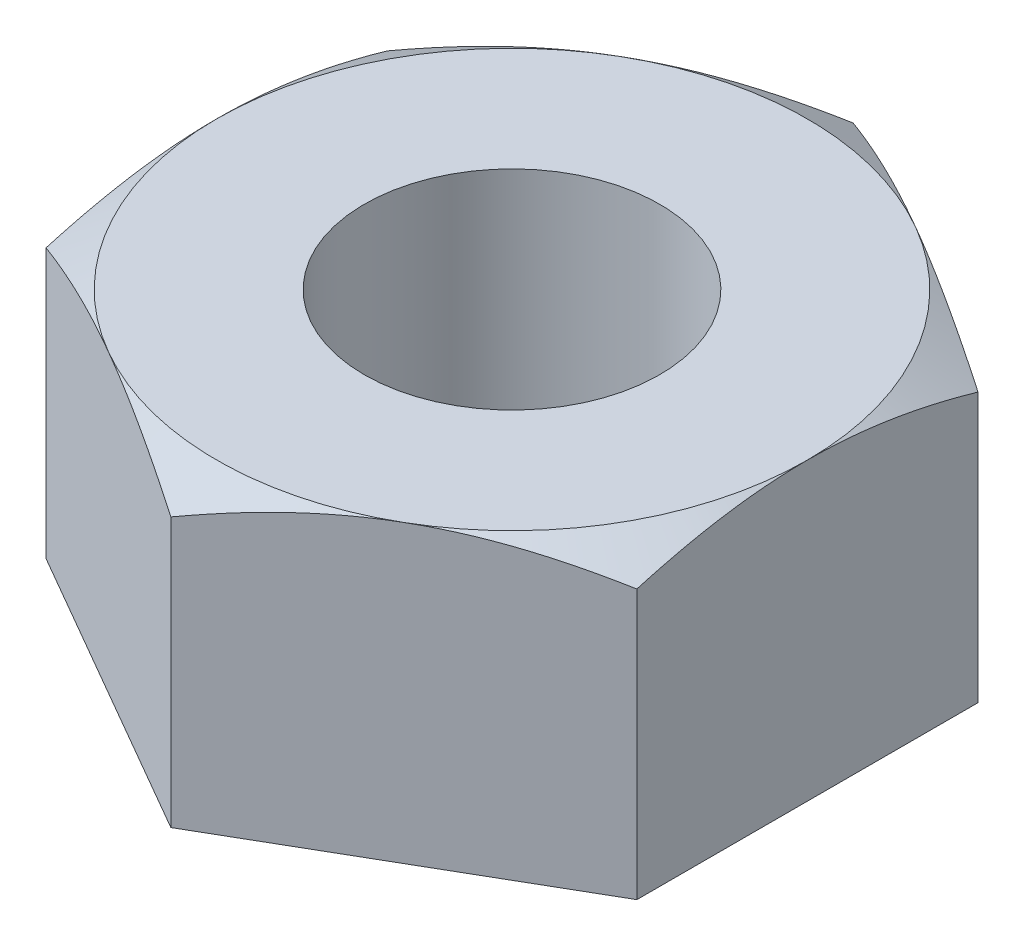
ISO-10303-21;
HEADER;
FILE_DESCRIPTION(('STEP AP214'),'2;1');
FILE_NAME('part.step','',(''),(''),'','','');
FILE_SCHEMA(('AUTOMOTIVE_DESIGN { 1 0 10303 214 1 1 1 1 }'));
ENDSEC;
DATA;
#1=APPLICATION_CONTEXT('core data for automotive mechanical design processes');
#2=APPLICATION_PROTOCOL_DEFINITION('international standard','automotive_design',2000,#1);
#3=PRODUCT_CONTEXT('',#1,'mechanical');
#4=PRODUCT('Part','Part','',(#3));
#5=PRODUCT_RELATED_PRODUCT_CATEGORY('part','',(#4));
#6=PRODUCT_DEFINITION_FORMATION('','',#4);
#7=PRODUCT_DEFINITION_CONTEXT('part definition',#1,'design');
#8=PRODUCT_DEFINITION('design','',#6,#7);
#9=PRODUCT_DEFINITION_SHAPE('','',#8);
#10=(LENGTH_UNIT() NAMED_UNIT(*) SI_UNIT(.MILLI.,.METRE.));
#11=(NAMED_UNIT(*) PLANE_ANGLE_UNIT() SI_UNIT($,.RADIAN.));
#12=(NAMED_UNIT(*) SI_UNIT($,.STERADIAN.) SOLID_ANGLE_UNIT());
#13=UNCERTAINTY_MEASURE_WITH_UNIT(LENGTH_MEASURE(1.E-05),#10,'distance_accuracy_value','');
#14=(GEOMETRIC_REPRESENTATION_CONTEXT(3) GLOBAL_UNCERTAINTY_ASSIGNED_CONTEXT((#13)) GLOBAL_UNIT_ASSIGNED_CONTEXT((#10,
#11,#12)) REPRESENTATION_CONTEXT('',''));
#15=CARTESIAN_POINT('',(0.,0.,0.));
#16=DIRECTION('',(0.,0.,1.));
#17=DIRECTION('',(1.,0.,0.));
#18=AXIS2_PLACEMENT_3D('',#15,#16,#17);
#19=CARTESIAN_POINT('',(5.,-5.,-2.88675134594813));
#20=DIRECTION('',(0.5,0.,-0.866025403784439));
#21=DIRECTION('',(-0.866025403784439,0.,-0.5));
#22=AXIS2_PLACEMENT_3D('',#19,#20,#21);
#23=PLANE('',#22);
#24=DIRECTION('',(0.,1.,0.));
#25=VECTOR('',#24,1.);
#26=CARTESIAN_POINT('',(0.,-5.,-5.77350269189626));
#27=LINE('',#26,#25);
#28=CARTESIAN_POINT('',(0.,-5.,-5.77350269189626));
#29=VERTEX_POINT('',#28);
#30=CARTESIAN_POINT('',(0.,-0.446581987385198,-5.77350269189626));
#31=VERTEX_POINT('',#30);
#32=EDGE_CURVE('E143',#29,#31,#27,.T.);
#33=ORIENTED_EDGE('',*,*,#32,.T.);
#34=CARTESIAN_POINT('',(-0.000200000000000367,-0.446648656051825,-5.7736181619501));
#35=CARTESIAN_POINT('',(0.219534594525184,-0.373386567637632,-5.64675433465071));
#36=CARTESIAN_POINT('',(0.44114858445958,-0.30675132191809,-5.5188054379059));
#37=CARTESIAN_POINT('',(0.888213995453512,-0.19043899101081,-5.26069210252318));
#38=CARTESIAN_POINT('',(1.11367335959077,-0.140803049915788,-5.13052307794721));
#39=CARTESIAN_POINT('',(1.56183230522351,-0.0635510254186982,-4.87177839004641));
#40=CARTESIAN_POINT('',(1.78446209310419,-0.0354203782834903,-4.74324302208387));
#41=CARTESIAN_POINT('',(2.11918990184664,-0.0101949219536854,-4.54998783160117));
#42=CARTESIAN_POINT('',(2.23084219680506,-0.00461345976948471,-4.48552534905128));
#43=CARTESIAN_POINT('',(2.4542499706738,0.000797783248529161,-4.35654081066911));
#44=CARTESIAN_POINT('',(2.56600544629031,0.00062774174179595,-4.2920187567385));
#45=CARTESIAN_POINT('',(2.87218423085064,-0.00775363179203732,-4.11524635305245));
#46=CARTESIAN_POINT('',(3.06650608596721,-0.0218297718972524,-4.00305457769146));
#47=CARTESIAN_POINT('',(3.4538601019977,-0.0664652571094313,-3.77941563226458));
#48=CARTESIAN_POINT('',(3.64689090137157,-0.0970398601475081,-3.66796924828419));
#49=CARTESIAN_POINT('',(4.03502534247485,-0.173468493621163,-3.44387972423144));
#50=CARTESIAN_POINT('',(4.23007999864173,-0.219646378878678,-3.3312648659868));
#51=CARTESIAN_POINT('',(4.61728034535877,-0.324451794491931,-3.10771464157941));
#52=CARTESIAN_POINT('',(4.80943099540809,-0.38305470343737,-2.99677641204847));
#53=CARTESIAN_POINT('',(5.0002,-0.446648656051824,-2.88663587589429));
#54=B_SPLINE_CURVE_WITH_KNOTS('',3,(#34,#35,#36,#37,#38,#39,#40,#41,#42,#43,#44,#45,#46,#47,#48,
#49,#50,#51,#52,#53),.UNSPECIFIED.,.F.,.F.,(4,2,2,2,2,2,2,2,2,4),(0.,0.79255584136309,
1.58701660053333,2.3618153748728,2.74884076077325,3.13585419177295,3.80962362599679,
4.48401723901189,5.17336882348928,5.86136694793725),.UNSPECIFIED.);
#55=CARTESIAN_POINT('',(2.5,0.,-4.33012701892219));
#56=VERTEX_POINT('',#55);
#57=EDGE_CURVE('E59',#31,#56,#54,.T.);
#58=ORIENTED_EDGE('',*,*,#57,.T.);
#59=CARTESIAN_POINT('',(5.,-0.446581987385199,-2.88675134594814));
#60=VERTEX_POINT('',#59);
#61=EDGE_CURVE('E222',#56,#60,#54,.T.);
#62=ORIENTED_EDGE('',*,*,#61,.T.);
#63=DIRECTION('',(0.,1.,0.));
#64=VECTOR('',#63,1.);
#65=CARTESIAN_POINT('',(5.,-5.,-2.88675134594813));
#66=LINE('',#65,#64);
#67=CARTESIAN_POINT('',(5.,-5.,-2.88675134594813));
#68=VERTEX_POINT('',#67);
#69=EDGE_CURVE('E135',#68,#60,#66,.T.);
#70=ORIENTED_EDGE('',*,*,#69,.F.);
#71=DIRECTION('',(-0.866025403784439,0.,-0.5));
#72=VECTOR('',#71,1.);
#73=CARTESIAN_POINT('',(5.,-5.,-2.88675134594813));
#74=LINE('',#73,#72);
#75=EDGE_CURVE('E350',#68,#29,#74,.T.);
#76=ORIENTED_EDGE('',*,*,#75,.T.);
#77=EDGE_LOOP('',(#33,#58,#62,#70,#76));
#78=FACE_BOUND('',#77,.T.);
#79=ADVANCED_FACE('F35',(#78),#23,.T.);
#80=CARTESIAN_POINT('',(5.,-5.,2.88675134594813));
#81=DIRECTION('',(1.,0.,0.));
#82=DIRECTION('',(0.,0.,-1.));
#83=AXIS2_PLACEMENT_3D('',#80,#81,#82);
#84=PLANE('',#83);
#85=ORIENTED_EDGE('',*,*,#69,.T.);
#86=CARTESIAN_POINT('',(5.,-2.39263438925412,-7.65609177212317));
#87=CARTESIAN_POINT('',(5.,-2.28654616396266,-7.43656343758357));
#88=CARTESIAN_POINT('',(5.,-2.18151254351552,-7.21651606414283));
#89=CARTESIAN_POINT('',(5.,-1.97415714895375,-6.77510259917479));
#90=CARTESIAN_POINT('',(5.,-1.87183584436515,-6.55373628734638));
#91=CARTESIAN_POINT('',(5.,-1.66996868374682,-6.10820850200618));
#92=CARTESIAN_POINT('',(5.,-1.57044206132401,-5.88403828224006));
#93=CARTESIAN_POINT('',(5.,-1.37566372855854,-5.43385534806404));
#94=CARTESIAN_POINT('',(5.,-1.2804117953843,-5.20784273042234));
#95=CARTESIAN_POINT('',(5.,-1.09418869749122,-4.7508098249394));
#96=CARTESIAN_POINT('',(5.,-1.00328444390956,-4.51976212356611));
#97=CARTESIAN_POINT('',(5.,-0.828595587063849,-4.05494131662996));
#98=CARTESIAN_POINT('',(5.,-0.744811775912219,-3.82116791112762));
#99=CARTESIAN_POINT('',(5.,-0.586614819502205,-3.35100475142416));
#100=CARTESIAN_POINT('',(5.,-0.51218175225236,-3.11462176833117));
#101=CARTESIAN_POINT('',(5.,-0.375104495774862,-2.63849286059447));
#102=CARTESIAN_POINT('',(5.,-0.31245657848201,-2.39874802529956));
#103=CARTESIAN_POINT('',(5.,-0.201987780260939,-1.91574317494575));
#104=CARTESIAN_POINT('',(5.,-0.154170849427518,-1.67248224143162));
#105=CARTESIAN_POINT('',(5.,-0.0765955282422638,-1.18299341060266));
#106=CARTESIAN_POINT('',(5.,-0.0468371538447095,-0.936765510666788));
#107=CARTESIAN_POINT('',(5.,-0.017651170854895,-0.567031819079379));
#108=CARTESIAN_POINT('',(5.,-0.0104962919792849,-0.444104782955959));
#109=CARTESIAN_POINT('',(5.,-0.0013954372389136,-0.198052381774452));
#110=CARTESIAN_POINT('',(5.,0.000550606269897096,-0.0749270193126888));
#111=CARTESIAN_POINT('',(5.,-0.000818485116155788,0.17125878581851));
#112=CARTESIAN_POINT('',(5.,-0.00413214208496495,0.294319237008559));
#113=CARTESIAN_POINT('',(5.,-0.0159366552893913,0.540193677552169));
#114=CARTESIAN_POINT('',(5.,-0.0244277728104914,0.663007654153305));
#115=CARTESIAN_POINT('',(5.,-0.0511064979626248,0.960682957245835));
#116=CARTESIAN_POINT('',(5.,-0.071889109997535,1.13531547825311));
#117=CARTESIAN_POINT('',(5.,-0.122765848593456,1.48321793429818));
#118=CARTESIAN_POINT('',(5.,-0.152861216820381,1.65648768447755));
#119=CARTESIAN_POINT('',(5.,-0.221299063222169,2.00155552519325));
#120=CARTESIAN_POINT('',(5.,-0.259649775120773,2.17335196708859));
#121=CARTESIAN_POINT('',(5.,-0.343428655666375,2.51518303239447));
#122=CARTESIAN_POINT('',(5.,-0.388856393418684,2.68521776239755));
#123=CARTESIAN_POINT('',(5.,-0.486888211190668,3.02770462413248));
#124=CARTESIAN_POINT('',(5.,-0.539640819369027,3.20011394779934));
#125=CARTESIAN_POINT('',(5.,-0.650358294888001,3.54311022463379));
#126=CARTESIAN_POINT('',(5.,-0.708319567123688,3.71369834521276));
#127=CARTESIAN_POINT('',(5.,-0.828257124207778,4.05236770745105));
#128=CARTESIAN_POINT('',(5.,-0.890208973537806,4.22045765494591));
#129=CARTESIAN_POINT('',(5.,-1.01774889077197,4.55533340532884));
#130=CARTESIAN_POINT('',(5.,-1.08333842831268,4.72211864960305));
#131=CARTESIAN_POINT('',(5.,-1.15038696222427,4.88829798170486));
#132=B_SPLINE_CURVE_WITH_KNOTS('',3,(#86,#87,#88,#89,#90,#91,#92,#93,#94,#95,#96,#97,#98,#99,
#100,#101,#102,#103,#104,#105,#106,#107,#108,#109,#110,#111,#112,#113,#114,#115,#116,#117,#118,
#119,#120,#121,#122,#123,#124,#125,#126,#127,#128,#129,#130,#131),.UNSPECIFIED.,.F.,.F.,(4,2,2,
2,2,2,2,2,2,2,2,2,2,2,2,2,2,2,2,2,2,2,4),(0.,0.731464953869325,1.4630557146924,2.19883307522443,
2.93457203639889,3.67934358933834,4.42419788610861,5.16743732301151,5.91044124982453,
6.65364289920091,7.39684520517622,7.76615669447499,8.13546338772164,8.50466632765175,
8.87388790130249,9.40118856909615,9.92855957198324,10.4564590222235,10.9843263431151,
11.5251238300906,12.0655508754377,12.6029360338292,13.1405399016667),.UNSPECIFIED.);
#133=CARTESIAN_POINT('',(5.,0.,0.));
#134=VERTEX_POINT('',#133);
#135=EDGE_CURVE('E221',#60,#134,#132,.T.);
#136=ORIENTED_EDGE('',*,*,#135,.T.);
#137=CARTESIAN_POINT('',(5.,-0.446581987385199,2.88675134594813));
#138=VERTEX_POINT('',#137);
#139=EDGE_CURVE('E215',#134,#138,#132,.T.);
#140=ORIENTED_EDGE('',*,*,#139,.T.);
#141=DIRECTION('',(0.,1.,0.));
#142=VECTOR('',#141,1.);
#143=CARTESIAN_POINT('',(5.,-5.,2.88675134594813));
#144=LINE('',#143,#142);
#145=CARTESIAN_POINT('',(5.,-5.,2.88675134594813));
#146=VERTEX_POINT('',#145);
#147=EDGE_CURVE('E132',#146,#138,#144,.T.);
#148=ORIENTED_EDGE('',*,*,#147,.F.);
#149=DIRECTION('',(0.,0.,-1.));
#150=VECTOR('',#149,1.);
#151=CARTESIAN_POINT('',(5.,-5.,2.88675134594813));
#152=LINE('',#151,#150);
#153=EDGE_CURVE('E145',#146,#68,#152,.T.);
#154=ORIENTED_EDGE('',*,*,#153,.T.);
#155=EDGE_LOOP('',(#85,#136,#140,#148,#154));
#156=FACE_BOUND('',#155,.T.);
#157=ADVANCED_FACE('F227',(#156),#84,.T.);
#158=CARTESIAN_POINT('',(0.,-5.,5.77350269189626));
#159=DIRECTION('',(0.5,0.,0.866025403784439));
#160=DIRECTION('',(0.866025403784439,0.,-0.5));
#161=AXIS2_PLACEMENT_3D('',#158,#159,#160);
#162=PLANE('',#161);
#163=ORIENTED_EDGE('',*,*,#147,.T.);
#164=CARTESIAN_POINT('',(5.0002,-0.446648656051824,2.88663587589429));
#165=CARTESIAN_POINT('',(4.78046540547481,-0.37338656763763,3.01349970319368));
#166=CARTESIAN_POINT('',(4.55885141554042,-0.306751321918088,3.14144859993849));
#167=CARTESIAN_POINT('',(4.11178600454649,-0.190438991010808,3.39956193532121));
#168=CARTESIAN_POINT('',(3.88632664040922,-0.140803049915787,3.52973095989718));
#169=CARTESIAN_POINT('',(3.43816769477649,-0.0635510254186969,3.78847564779798));
#170=CARTESIAN_POINT('',(3.21553790689581,-0.035420378283489,3.91701101576052));
#171=CARTESIAN_POINT('',(2.88081009815336,-0.0101949219536844,4.11026620624322));
#172=CARTESIAN_POINT('',(2.76915780319494,-0.00461345976948378,4.17472868879311));
#173=CARTESIAN_POINT('',(2.5457500293262,0.000797783248529996,4.30371322717528));
#174=CARTESIAN_POINT('',(2.43399455370969,0.000627741741796778,4.36823528110589));
#175=CARTESIAN_POINT('',(2.12781576914936,-0.00775363179203635,4.54500768479194));
#176=CARTESIAN_POINT('',(1.93349391403279,-0.0218297718972511,4.65719946015293));
#177=CARTESIAN_POINT('',(1.54613989800229,-0.0664652571094299,4.88083840557981));
#178=CARTESIAN_POINT('',(1.35310909862843,-0.0970398601475068,4.9922847895602));
#179=CARTESIAN_POINT('',(0.964974657525145,-0.173468493621161,5.21637431361295));
#180=CARTESIAN_POINT('',(0.769920001358264,-0.219646378878677,5.32898917185759));
#181=CARTESIAN_POINT('',(0.382719654641232,-0.32445179449193,5.55253939626498));
#182=CARTESIAN_POINT('',(0.190569004591913,-0.383054703437369,5.66347762579592));
#183=CARTESIAN_POINT('',(-0.00020000000000051,-0.446648656051824,5.7736181619501));
#184=B_SPLINE_CURVE_WITH_KNOTS('',3,(#164,#165,#166,#167,#168,#169,#170,#171,#172,#173,#174,
#175,#176,#177,#178,#179,#180,#181,#182,#183),.UNSPECIFIED.,.F.,.F.,(4,2,2,2,2,2,2,2,2,4),(0.,
0.79255584136309,1.58701660053333,2.3618153748728,2.74884076077325,3.13585419177295,
3.80962362599679,4.48401723901189,5.17336882348928,5.86136694793725),.UNSPECIFIED.);
#185=CARTESIAN_POINT('',(2.5,0.,4.3301270189222));
#186=VERTEX_POINT('',#185);
#187=EDGE_CURVE('E126',#138,#186,#184,.T.);
#188=ORIENTED_EDGE('',*,*,#187,.T.);
#189=CARTESIAN_POINT('',(0.,-0.446581987385199,5.77350269189626));
#190=VERTEX_POINT('',#189);
#191=EDGE_CURVE('E111',#186,#190,#184,.T.);
#192=ORIENTED_EDGE('',*,*,#191,.T.);
#193=DIRECTION('',(0.,1.,0.));
#194=VECTOR('',#193,1.);
#195=CARTESIAN_POINT('',(0.,-5.,5.77350269189626));
#196=LINE('',#195,#194);
#197=CARTESIAN_POINT('',(0.,-5.,5.77350269189626));
#198=VERTEX_POINT('',#197);
#199=EDGE_CURVE('E124',#198,#190,#196,.T.);
#200=ORIENTED_EDGE('',*,*,#199,.F.);
#201=DIRECTION('',(0.866025403784439,0.,-0.5));
#202=VECTOR('',#201,1.);
#203=CARTESIAN_POINT('',(0.,-5.,5.77350269189626));
#204=LINE('',#203,#202);
#205=EDGE_CURVE('E149',#198,#146,#204,.T.);
#206=ORIENTED_EDGE('',*,*,#205,.T.);
#207=EDGE_LOOP('',(#163,#188,#192,#200,#206));
#208=FACE_BOUND('',#207,.T.);
#209=ADVANCED_FACE('F122',(#208),#162,.T.);
#210=CARTESIAN_POINT('',(-5.,-5.,2.88675134594813));
#211=DIRECTION('',(-0.5,0.,0.866025403784439));
#212=DIRECTION('',(0.866025403784439,0.,0.5));
#213=AXIS2_PLACEMENT_3D('',#210,#211,#212);
#214=PLANE('',#213);
#215=ORIENTED_EDGE('',*,*,#199,.T.);
#216=CARTESIAN_POINT('',(0.000199999999999782,-0.446648656051824,5.7736181619501));
#217=CARTESIAN_POINT('',(-0.219534594525185,-0.373386567637631,5.64675433465071));
#218=CARTESIAN_POINT('',(-0.44114858445958,-0.306751321918089,5.5188054379059));
#219=CARTESIAN_POINT('',(-0.888213995453512,-0.190438991010808,5.26069210252318));
#220=CARTESIAN_POINT('',(-1.11367335959077,-0.140803049915787,5.13052307794721));
#221=CARTESIAN_POINT('',(-1.56183230522351,-0.0635510254186965,4.87177839004641));
#222=CARTESIAN_POINT('',(-1.78446209310419,-0.0354203782834886,4.74324302208387));
#223=CARTESIAN_POINT('',(-2.11918990184664,-0.0101949219536839,4.54998783160116));
#224=CARTESIAN_POINT('',(-2.23084219680506,-0.00461345976948327,4.48552534905128));
#225=CARTESIAN_POINT('',(-2.4542499706738,0.00079778324853047,4.35654081066911));
#226=CARTESIAN_POINT('',(-2.56600544629031,0.000627741741797269,4.2920187567385));
#227=CARTESIAN_POINT('',(-2.87218423085064,-0.00775363179203585,4.11524635305244));
#228=CARTESIAN_POINT('',(-3.06650608596721,-0.0218297718972507,4.00305457769146));
#229=CARTESIAN_POINT('',(-3.4538601019977,-0.0664652571094293,3.77941563226457));
#230=CARTESIAN_POINT('',(-3.64689090137157,-0.097039860147506,3.66796924828418));
#231=CARTESIAN_POINT('',(-4.03502534247485,-0.173468493621161,3.44387972423144));
#232=CARTESIAN_POINT('',(-4.23007999864173,-0.219646378878677,3.3312648659868));
#233=CARTESIAN_POINT('',(-4.61728034535877,-0.32445179449193,3.1077146415794));
#234=CARTESIAN_POINT('',(-4.80943099540809,-0.383054703437369,2.99677641204847));
#235=CARTESIAN_POINT('',(-5.0002,-0.446648656051823,2.88663587589429));
#236=B_SPLINE_CURVE_WITH_KNOTS('',3,(#216,#217,#218,#219,#220,#221,#222,#223,#224,#225,#226,
#227,#228,#229,#230,#231,#232,#233,#234,#235),.UNSPECIFIED.,.F.,.F.,(4,2,2,2,2,2,2,2,2,4),(0.,
0.79255584136309,1.58701660053333,2.3618153748728,2.74884076077325,3.13585419177295,
3.80962362599679,4.48401723901189,5.17336882348928,5.86136694793725),.UNSPECIFIED.);
#237=CARTESIAN_POINT('',(-2.5,0.,4.33012701892219));
#238=VERTEX_POINT('',#237);
#239=EDGE_CURVE('E108',#190,#238,#236,.T.);
#240=ORIENTED_EDGE('',*,*,#239,.T.);
#241=CARTESIAN_POINT('',(-5.,-0.446581987385199,2.88675134594813));
#242=VERTEX_POINT('',#241);
#243=EDGE_CURVE('E117',#238,#242,#236,.T.);
#244=ORIENTED_EDGE('',*,*,#243,.T.);
#245=DIRECTION('',(0.,1.,0.));
#246=VECTOR('',#245,1.);
#247=CARTESIAN_POINT('',(-5.,-5.,2.88675134594813));
#248=LINE('',#247,#246);
#249=CARTESIAN_POINT('',(-5.,-5.,2.88675134594813));
#250=VERTEX_POINT('',#249);
#251=EDGE_CURVE('E133',#250,#242,#248,.T.);
#252=ORIENTED_EDGE('',*,*,#251,.F.);
#253=DIRECTION('',(0.866025403784438,0.,0.5));
#254=VECTOR('',#253,1.);
#255=CARTESIAN_POINT('',(-5.,-5.,2.88675134594813));
#256=LINE('',#255,#254);
#257=EDGE_CURVE('E131',#250,#198,#256,.T.);
#258=ORIENTED_EDGE('',*,*,#257,.T.);
#259=EDGE_LOOP('',(#215,#240,#244,#252,#258));
#260=FACE_BOUND('',#259,.T.);
#261=ADVANCED_FACE('F129',(#260),#214,.T.);
#262=CARTESIAN_POINT('',(-5.,-5.,-2.88675134594813));
#263=DIRECTION('',(-1.,0.,0.));
#264=DIRECTION('',(0.,0.,1.));
#265=AXIS2_PLACEMENT_3D('',#262,#263,#264);
#266=PLANE('',#265);
#267=ORIENTED_EDGE('',*,*,#251,.T.);
#268=CARTESIAN_POINT('',(-5.,-2.39263352655076,-7.65608998744865));
#269=CARTESIAN_POINT('',(-5.,-2.28654533817203,-7.43656171400166));
#270=CARTESIAN_POINT('',(-5.,-2.18151175461592,-7.21651440170022));
#271=CARTESIAN_POINT('',(-5.,-1.97415643363973,-6.77510105921518));
#272=CARTESIAN_POINT('',(-5.,-1.87183516574565,-6.55373480873052));
#273=CARTESIAN_POINT('',(-5.,-1.66996807853488,-6.10820714710357));
#274=CARTESIAN_POINT('',(-5.,-1.57044149281728,-5.88403698971124));
#275=CARTESIAN_POINT('',(-5.,-1.37566323278679,-5.43385418074677));
#276=CARTESIAN_POINT('',(-5.,-1.28041133564241,-5.20784162594278));
#277=CARTESIAN_POINT('',(-5.,-1.09418830918939,-4.75080884782756));
#278=CARTESIAN_POINT('',(-5.,-1.00328409099868,-4.51976121099505));
#279=CARTESIAN_POINT('',(-5.,-0.828595302971936,-4.05494053422099));
#280=CARTESIAN_POINT('',(-5.,-0.744811525247639,-3.82116719434024));
#281=CARTESIAN_POINT('',(-5.,-0.586614632364609,-3.35100416711889));
#282=CARTESIAN_POINT('',(-5.,-0.512181595225263,-3.11462125088188));
#283=CARTESIAN_POINT('',(-5.,-0.375104393872371,-2.63849247870023));
#284=CARTESIAN_POINT('',(-5.,-0.312456501596944,-2.3987477121033));
#285=CARTESIAN_POINT('',(-5.,-0.201987753994866,-1.91574303714497));
#286=CARTESIAN_POINT('',(-5.,-0.15417084655864,-1.672482210841));
#287=CARTESIAN_POINT('',(-5.,-0.0765955557924021,-1.18299359688664));
#288=CARTESIAN_POINT('',(-5.,-0.0468371884284096,-0.936765806613282));
#289=CARTESIAN_POINT('',(-5.,-0.0176512015862968,-0.56703227932385));
#290=CARTESIAN_POINT('',(-5.,-0.0104963190599472,-0.444105297658542));
#291=CARTESIAN_POINT('',(-5.,-0.00139545226904105,-0.198053005238568));
#292=CARTESIAN_POINT('',(-5.,0.000550599639614043,-0.0749276970802313));
#293=CARTESIAN_POINT('',(-5.,-0.000818470345664423,0.17125799989235));
#294=CARTESIAN_POINT('',(-5.,-0.00413211431301167,0.294318397227085));
#295=CARTESIAN_POINT('',(-5.,-0.0159365972827597,0.540192730788836));
#296=CARTESIAN_POINT('',(-5.,-0.0244276975701647,0.663006654263479));
#297=CARTESIAN_POINT('',(-5.,-0.0511063802753004,0.960681872881666));
#298=CARTESIAN_POINT('',(-5.,-0.0718889676982858,1.1353143627994));
#299=CARTESIAN_POINT('',(-5.,-0.122765655722695,1.4832167579939));
#300=CARTESIAN_POINT('',(-5.,-0.152860997990034,1.65648647841238));
#301=CARTESIAN_POINT('',(-5.,-0.221298792011552,2.00155426058701));
#302=CARTESIAN_POINT('',(-5.,-0.259649477486406,2.17335067370375));
#303=CARTESIAN_POINT('',(-5.,-0.343428305385014,2.51518168221057));
#304=CARTESIAN_POINT('',(-5.,-0.388856016914005,2.68521638419314));
#305=CARTESIAN_POINT('',(-5.,-0.486887782054297,3.02770318928896));
#306=CARTESIAN_POINT('',(-5.,-0.539640363823947,3.20011248435316));
#307=CARTESIAN_POINT('',(-5.,-0.650357787302633,3.54310870430182));
#308=CARTESIAN_POINT('',(-5.,-0.708319033907078,3.7136967965972));
#309=CARTESIAN_POINT('',(-5.,-0.828256540728483,4.0523661026798));
#310=CARTESIAN_POINT('',(-5.,-0.890208365426375,4.22045602230063));
#311=CARTESIAN_POINT('',(-5.,-1.01774823413813,4.55533171687456));
#312=CARTESIAN_POINT('',(-5.,-1.08333774778778,4.72211693321422));
#313=CARTESIAN_POINT('',(-5.,-1.15038625817726,4.88829623733364));
#314=B_SPLINE_CURVE_WITH_KNOTS('',3,(#268,#269,#270,#271,#272,#273,#274,#275,#276,#277,#278,
#279,#280,#281,#282,#283,#284,#285,#286,#287,#288,#289,#290,#291,#292,#293,#294,#295,#296,#297,
#298,#299,#300,#301,#302,#303,#304,#305,#306,#307,#308,#309,#310,#311,#312,#313),.UNSPECIFIED.,
.F.,.F.,(4,2,2,2,2,2,2,2,2,2,2,2,2,2,2,2,2,2,2,2,2,2,4),(0.,0.73146474066535,1.46305528824908,
2.19883243307485,2.93457117856033,3.67934251246857,4.4241965901336,5.16743580871988,
5.91043951739337,6.65364083834805,7.39684281638514,7.76615414335455,8.13546067426609,
8.50466345177854,8.87388486298451,9.40118542949726,9.92855633110015,10.4564556797854,
10.9843228991235,11.525120280828,12.0655472210641,12.6029322754131,13.1405360390026),.UNSPECIFIED.);
#315=CARTESIAN_POINT('',(-5.,0.,0.));
#316=VERTEX_POINT('',#315);
#317=EDGE_CURVE('E177',#242,#316,#314,.F.);
#318=ORIENTED_EDGE('',*,*,#317,.T.);
#319=CARTESIAN_POINT('',(-5.,-0.446581987385199,-2.88675134594813));
#320=VERTEX_POINT('',#319);
#321=EDGE_CURVE('E175',#316,#320,#314,.F.);
#322=ORIENTED_EDGE('',*,*,#321,.T.);
#323=DIRECTION('',(0.,1.,0.));
#324=VECTOR('',#323,1.);
#325=CARTESIAN_POINT('',(-5.,-5.,-2.88675134594813));
#326=LINE('',#325,#324);
#327=CARTESIAN_POINT('',(-5.,-5.,-2.88675134594813));
#328=VERTEX_POINT('',#327);
#329=EDGE_CURVE('E138',#328,#320,#326,.T.);
#330=ORIENTED_EDGE('',*,*,#329,.F.);
#331=DIRECTION('',(0.,0.,1.));
#332=VECTOR('',#331,1.);
#333=CARTESIAN_POINT('',(-5.,-5.,-2.88675134594813));
#334=LINE('',#333,#332);
#335=EDGE_CURVE('E353',#328,#250,#334,.T.);
#336=ORIENTED_EDGE('',*,*,#335,.T.);
#337=EDGE_LOOP('',(#267,#318,#322,#330,#336));
#338=FACE_BOUND('',#337,.T.);
#339=ADVANCED_FACE('F234',(#338),#266,.T.);
#340=CARTESIAN_POINT('',(0.,-5.,-5.77350269189626));
#341=DIRECTION('',(-0.5,0.,-0.866025403784439));
#342=DIRECTION('',(-0.866025403784439,0.,0.5));
#343=AXIS2_PLACEMENT_3D('',#340,#341,#342);
#344=PLANE('',#343);
#345=ORIENTED_EDGE('',*,*,#329,.T.);
#346=CARTESIAN_POINT('',(-5.0002,-0.446648656051825,-2.8866358758943));
#347=CARTESIAN_POINT('',(-4.78046540547482,-0.373386567637633,-3.01349970319368));
#348=CARTESIAN_POINT('',(-4.55885141554042,-0.30675132191809,-3.14144859993849));
#349=CARTESIAN_POINT('',(-4.11178600454649,-0.19043899101081,-3.39956193532121));
#350=CARTESIAN_POINT('',(-3.88632664040923,-0.140803049915789,-3.52973095989718));
#351=CARTESIAN_POINT('',(-3.43816769477649,-0.0635510254186989,-3.78847564779798));
#352=CARTESIAN_POINT('',(-3.21553790689581,-0.035420378283491,-3.91701101576052));
#353=CARTESIAN_POINT('',(-2.88081009815336,-0.0101949219536862,-4.11026620624323));
#354=CARTESIAN_POINT('',(-2.76915780319494,-0.00461345976948557,-4.17472868879311));
#355=CARTESIAN_POINT('',(-2.5457500293262,0.000797783248528275,-4.30371322717528));
#356=CARTESIAN_POINT('',(-2.43399455370969,0.000627741741795071,-4.36823528110589));
#357=CARTESIAN_POINT('',(-2.12781576914936,-0.00775363179203818,-4.54500768479195));
#358=CARTESIAN_POINT('',(-1.93349391403279,-0.0218297718972532,-4.65719946015293));
#359=CARTESIAN_POINT('',(-1.5461398980023,-0.0664652571094319,-4.88083840557982));
#360=CARTESIAN_POINT('',(-1.35310909862843,-0.0970398601475086,-4.99228478956021));
#361=CARTESIAN_POINT('',(-0.964974657525147,-0.173468493621163,-5.21637431361295));
#362=CARTESIAN_POINT('',(-0.769920001358265,-0.219646378878679,-5.32898917185759));
#363=CARTESIAN_POINT('',(-0.382719654641232,-0.324451794491933,-5.55253939626498));
#364=CARTESIAN_POINT('',(-0.190569004591914,-0.383054703437372,-5.66347762579592));
#365=CARTESIAN_POINT('',(0.000199999999999476,-0.446648656051825,-5.7736181619501));
#366=B_SPLINE_CURVE_WITH_KNOTS('',3,(#346,#347,#348,#349,#350,#351,#352,#353,#354,#355,#356,
#357,#358,#359,#360,#361,#362,#363,#364,#365),.UNSPECIFIED.,.F.,.F.,(4,2,2,2,2,2,2,2,2,4),(0.,
0.79255584136309,1.58701660053333,2.3618153748728,2.74884076077325,3.13585419177295,
3.80962362599679,4.48401723901189,5.17336882348928,5.86136694793725),.UNSPECIFIED.);
#367=CARTESIAN_POINT('',(-2.5,0.,-4.3301270189222));
#368=VERTEX_POINT('',#367);
#369=EDGE_CURVE('E169',#320,#368,#366,.T.);
#370=ORIENTED_EDGE('',*,*,#369,.T.);
#371=EDGE_CURVE('E171',#368,#31,#366,.T.);
#372=ORIENTED_EDGE('',*,*,#371,.T.);
#373=ORIENTED_EDGE('',*,*,#32,.F.);
#374=DIRECTION('',(-0.866025403784439,0.,0.5));
#375=VECTOR('',#374,1.);
#376=CARTESIAN_POINT('',(0.,-5.,-5.77350269189626));
#377=LINE('',#376,#375);
#378=EDGE_CURVE('E351',#29,#328,#377,.T.);
#379=ORIENTED_EDGE('',*,*,#378,.T.);
#380=EDGE_LOOP('',(#345,#370,#372,#373,#379));
#381=FACE_BOUND('',#380,.T.);
#382=ADVANCED_FACE('F170',(#381),#344,.T.);
#383=CARTESIAN_POINT('',(0.,-5.,0.));
#384=DIRECTION('',(0.,1.,0.));
#385=DIRECTION('',(0.,0.,1.));
#386=AXIS2_PLACEMENT_3D('',#383,#384,#385);
#387=PLANE('',#386);
#388=CARTESIAN_POINT('',(0.,-5.,0.));
#389=DIRECTION('',(0.,1.,0.));
#390=DIRECTION('',(0.,0.,1.));
#391=AXIS2_PLACEMENT_3D('',#388,#389,#390);
#392=CIRCLE('',#391,2.5);
#393=CARTESIAN_POINT('',(0.,-5.,2.5));
#394=VERTEX_POINT('',#393);
#395=EDGE_CURVE('E344',#394,#394,#392,.T.);
#396=ORIENTED_EDGE('',*,*,#395,.T.);
#397=EDGE_LOOP('',(#396));
#398=FACE_BOUND('',#397,.T.);
#399=ORIENTED_EDGE('',*,*,#75,.F.);
#400=ORIENTED_EDGE('',*,*,#153,.F.);
#401=ORIENTED_EDGE('',*,*,#205,.F.);
#402=ORIENTED_EDGE('',*,*,#257,.F.);
#403=ORIENTED_EDGE('',*,*,#335,.F.);
#404=ORIENTED_EDGE('',*,*,#378,.F.);
#405=EDGE_LOOP('',(#399,#400,#401,#402,#403,#404));
#406=FACE_BOUND('',#405,.T.);
#407=ADVANCED_FACE('F198',(#398,#406),#387,.F.);
#408=CARTESIAN_POINT('',(0.,0.,0.));
#409=DIRECTION('',(0.,-1.,0.));
#410=DIRECTION('',(0.,0.,-1.));
#411=AXIS2_PLACEMENT_3D('',#408,#409,#410);
#412=CONICAL_SURFACE('',#411,5.,1.0471975511966);
#413=CARTESIAN_POINT('',(0.,0.,0.));
#414=DIRECTION('',(0.,1.,0.));
#415=DIRECTION('',(0.,0.,1.));
#416=AXIS2_PLACEMENT_3D('',#413,#414,#415);
#417=CIRCLE('',#416,5.);
#418=EDGE_CURVE('E39',#238,#186,#417,.T.);
#419=ORIENTED_EDGE('',*,*,#418,.F.);
#420=ORIENTED_EDGE('',*,*,#239,.F.);
#421=ORIENTED_EDGE('',*,*,#191,.F.);
#422=EDGE_LOOP('',(#419,#420,#421));
#423=FACE_BOUND('',#422,.T.);
#424=ADVANCED_FACE('F110',(#423),#412,.T.);
#425=EDGE_CURVE('E157',#316,#238,#417,.T.);
#426=ORIENTED_EDGE('',*,*,#425,.F.);
#427=ORIENTED_EDGE('',*,*,#317,.F.);
#428=ORIENTED_EDGE('',*,*,#243,.F.);
#429=EDGE_LOOP('',(#426,#427,#428));
#430=FACE_BOUND('',#429,.T.);
#431=ADVANCED_FACE('F196',(#430),#412,.T.);
#432=EDGE_CURVE('E159',#368,#316,#417,.T.);
#433=ORIENTED_EDGE('',*,*,#432,.F.);
#434=ORIENTED_EDGE('',*,*,#369,.F.);
#435=ORIENTED_EDGE('',*,*,#321,.F.);
#436=EDGE_LOOP('',(#433,#434,#435));
#437=FACE_BOUND('',#436,.T.);
#438=ADVANCED_FACE('F190',(#437),#412,.T.);
#439=ORIENTED_EDGE('',*,*,#371,.F.);
#440=EDGE_CURVE('E44',#56,#368,#417,.T.);
#441=ORIENTED_EDGE('',*,*,#440,.F.);
#442=ORIENTED_EDGE('',*,*,#57,.F.);
#443=EDGE_LOOP('',(#439,#441,#442));
#444=FACE_BOUND('',#443,.T.);
#445=ADVANCED_FACE('F195',(#444),#412,.T.);
#446=EDGE_CURVE('E11',#134,#56,#417,.T.);
#447=ORIENTED_EDGE('',*,*,#446,.F.);
#448=ORIENTED_EDGE('',*,*,#135,.F.);
#449=ORIENTED_EDGE('',*,*,#61,.F.);
#450=EDGE_LOOP('',(#447,#448,#449));
#451=FACE_BOUND('',#450,.T.);
#452=ADVANCED_FACE('F299',(#451),#412,.T.);
#453=CARTESIAN_POINT('',(0.,0.,0.));
#454=DIRECTION('',(0.,1.,0.));
#455=DIRECTION('',(0.,0.,1.));
#456=AXIS2_PLACEMENT_3D('',#453,#454,#455);
#457=CIRCLE('',#456,5.);
#458=EDGE_CURVE('E51',#186,#134,#457,.T.);
#459=ORIENTED_EDGE('',*,*,#458,.F.);
#460=ORIENTED_EDGE('',*,*,#187,.F.);
#461=ORIENTED_EDGE('',*,*,#139,.F.);
#462=EDGE_LOOP('',(#459,#460,#461));
#463=FACE_BOUND('',#462,.T.);
#464=ADVANCED_FACE('F277',(#463),#412,.T.);
#465=CARTESIAN_POINT('',(0.,0.,0.));
#466=DIRECTION('',(0.,1.,0.));
#467=DIRECTION('',(0.,0.,1.));
#468=AXIS2_PLACEMENT_3D('',#465,#466,#467);
#469=PLANE('',#468);
#470=CARTESIAN_POINT('',(0.,0.,0.));
#471=DIRECTION('',(0.,1.,0.));
#472=DIRECTION('',(0.,0.,1.));
#473=AXIS2_PLACEMENT_3D('',#470,#471,#472);
#474=CIRCLE('',#473,2.5);
#475=CARTESIAN_POINT('',(0.,0.,2.5));
#476=VERTEX_POINT('',#475);
#477=EDGE_CURVE('E347',#476,#476,#474,.T.);
#478=ORIENTED_EDGE('',*,*,#477,.F.);
#479=EDGE_LOOP('',(#478));
#480=FACE_BOUND('',#479,.T.);
#481=ORIENTED_EDGE('',*,*,#418,.T.);
#482=ORIENTED_EDGE('',*,*,#458,.T.);
#483=ORIENTED_EDGE('',*,*,#446,.T.);
#484=ORIENTED_EDGE('',*,*,#440,.T.);
#485=ORIENTED_EDGE('',*,*,#432,.T.);
#486=ORIENTED_EDGE('',*,*,#425,.T.);
#487=EDGE_LOOP('',(#481,#482,#483,#484,#485,#486));
#488=FACE_BOUND('',#487,.T.);
#489=ADVANCED_FACE('F166',(#480,#488),#469,.T.);
#490=CARTESIAN_POINT('',(0.,0.,0.));
#491=DIRECTION('',(0.,1.,0.));
#492=DIRECTION('',(0.,0.,1.));
#493=AXIS2_PLACEMENT_3D('',#490,#491,#492);
#494=CYLINDRICAL_SURFACE('',#493,2.5);
#495=ORIENTED_EDGE('',*,*,#395,.F.);
#496=EDGE_LOOP('',(#495));
#497=FACE_BOUND('',#496,.T.);
#498=ORIENTED_EDGE('',*,*,#477,.T.);
#499=EDGE_LOOP('',(#498));
#500=FACE_BOUND('',#499,.T.);
#501=ADVANCED_FACE('F197',(#497,#500),#494,.F.);
#502=CLOSED_SHELL('',(#79,#157,#209,#261,#339,#382,#407,#424,#431,#438,#445,#452,#464,#489,#501));
#503=MANIFOLD_SOLID_BREP('B2',#502);
#504=ADVANCED_BREP_SHAPE_REPRESENTATION('',(#18,#503),#14);
#505=SHAPE_DEFINITION_REPRESENTATION(#9,#504);
ENDSEC;
END-ISO-10303-21;
